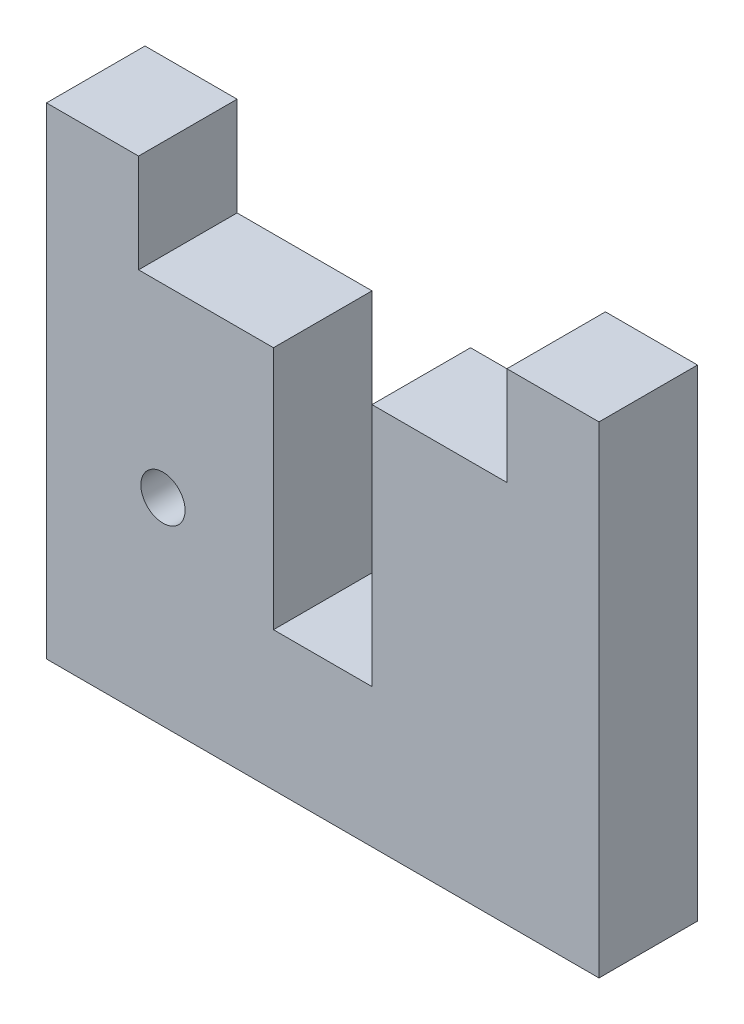
ISO-10303-21;
HEADER;
FILE_DESCRIPTION(('STEP AP214'),'2;1');
FILE_NAME('part.step','',(''),(''),'','','');
FILE_SCHEMA(('AUTOMOTIVE_DESIGN { 1 0 10303 214 1 1 1 1 }'));
ENDSEC;
DATA;
#1=APPLICATION_CONTEXT('core data for automotive mechanical design processes');
#2=APPLICATION_PROTOCOL_DEFINITION('international standard','automotive_design',2000,#1);
#3=PRODUCT_CONTEXT('',#1,'mechanical');
#4=PRODUCT('Part','Part','',(#3));
#5=PRODUCT_RELATED_PRODUCT_CATEGORY('part','',(#4));
#6=PRODUCT_DEFINITION_FORMATION('','',#4);
#7=PRODUCT_DEFINITION_CONTEXT('part definition',#1,'design');
#8=PRODUCT_DEFINITION('design','',#6,#7);
#9=PRODUCT_DEFINITION_SHAPE('','',#8);
#10=(LENGTH_UNIT() NAMED_UNIT(*) SI_UNIT(.MILLI.,.METRE.));
#11=(NAMED_UNIT(*) PLANE_ANGLE_UNIT() SI_UNIT($,.RADIAN.));
#12=(NAMED_UNIT(*) SI_UNIT($,.STERADIAN.) SOLID_ANGLE_UNIT());
#13=UNCERTAINTY_MEASURE_WITH_UNIT(LENGTH_MEASURE(1.E-05),#10,'distance_accuracy_value','');
#14=(GEOMETRIC_REPRESENTATION_CONTEXT(3) GLOBAL_UNCERTAINTY_ASSIGNED_CONTEXT((#13)) GLOBAL_UNIT_ASSIGNED_CONTEXT((#10,
#11,#12)) REPRESENTATION_CONTEXT('',''));
#15=CARTESIAN_POINT('',(0.,0.,0.));
#16=DIRECTION('',(0.,0.,1.));
#17=DIRECTION('',(1.,0.,0.));
#18=AXIS2_PLACEMENT_3D('',#15,#16,#17);
#19=CARTESIAN_POINT('',(0.,0.,5.35));
#20=DIRECTION('',(0.,0.,-1.));
#21=DIRECTION('',(-1.,0.,0.));
#22=AXIS2_PLACEMENT_3D('',#19,#20,#21);
#23=PLANE('',#22);
#24=DIRECTION('',(0.,-1.,0.));
#25=VECTOR('',#24,1.);
#26=CARTESIAN_POINT('',(-15.,0.,5.35));
#27=LINE('',#26,#25);
#28=CARTESIAN_POINT('',(-15.,26.15,5.35));
#29=VERTEX_POINT('',#28);
#30=CARTESIAN_POINT('',(-15.,0.,5.35));
#31=VERTEX_POINT('',#30);
#32=EDGE_CURVE('E176',#29,#31,#27,.T.);
#33=ORIENTED_EDGE('',*,*,#32,.T.);
#34=DIRECTION('',(1.,0.,0.));
#35=VECTOR('',#34,1.);
#36=CARTESIAN_POINT('',(-15.,0.,5.35));
#37=LINE('',#36,#35);
#38=CARTESIAN_POINT('',(15.,0.,5.35));
#39=VERTEX_POINT('',#38);
#40=EDGE_CURVE('E104',#31,#39,#37,.T.);
#41=ORIENTED_EDGE('',*,*,#40,.T.);
#42=DIRECTION('',(0.,1.,0.));
#43=VECTOR('',#42,1.);
#44=CARTESIAN_POINT('',(15.,0.,5.35));
#45=LINE('',#44,#43);
#46=CARTESIAN_POINT('',(15.,26.15,5.35));
#47=VERTEX_POINT('',#46);
#48=EDGE_CURVE('E203',#39,#47,#45,.T.);
#49=ORIENTED_EDGE('',*,*,#48,.T.);
#50=DIRECTION('',(-1.,0.,0.));
#51=VECTOR('',#50,1.);
#52=CARTESIAN_POINT('',(10.,26.15,5.35));
#53=LINE('',#52,#51);
#54=CARTESIAN_POINT('',(10.,26.15,5.35));
#55=VERTEX_POINT('',#54);
#56=EDGE_CURVE('E222',#47,#55,#53,.T.);
#57=ORIENTED_EDGE('',*,*,#56,.T.);
#58=DIRECTION('',(0.,-1.,0.));
#59=VECTOR('',#58,1.);
#60=CARTESIAN_POINT('',(10.,26.15,5.35));
#61=LINE('',#60,#59);
#62=CARTESIAN_POINT('',(10.,20.8,5.35));
#63=VERTEX_POINT('',#62);
#64=EDGE_CURVE('E219',#55,#63,#61,.T.);
#65=ORIENTED_EDGE('',*,*,#64,.T.);
#66=DIRECTION('',(-1.,0.,0.));
#67=VECTOR('',#66,1.);
#68=CARTESIAN_POINT('',(2.675,20.8,5.35));
#69=LINE('',#68,#67);
#70=CARTESIAN_POINT('',(2.675,20.8,5.35));
#71=VERTEX_POINT('',#70);
#72=EDGE_CURVE('E221',#63,#71,#69,.T.);
#73=ORIENTED_EDGE('',*,*,#72,.T.);
#74=DIRECTION('',(0.,-1.,0.));
#75=VECTOR('',#74,1.);
#76=CARTESIAN_POINT('',(2.675,20.8,5.35));
#77=LINE('',#76,#75);
#78=CARTESIAN_POINT('',(2.675,7.53977462398501,5.35));
#79=VERTEX_POINT('',#78);
#80=EDGE_CURVE('E224',#71,#79,#77,.T.);
#81=ORIENTED_EDGE('',*,*,#80,.T.);
#82=DIRECTION('',(-1.,0.,0.));
#83=VECTOR('',#82,1.);
#84=CARTESIAN_POINT('',(-2.675,7.53977462398501,5.35));
#85=LINE('',#84,#83);
#86=CARTESIAN_POINT('',(-2.675,7.53977462398501,5.35));
#87=VERTEX_POINT('',#86);
#88=EDGE_CURVE('E230',#79,#87,#85,.T.);
#89=ORIENTED_EDGE('',*,*,#88,.T.);
#90=DIRECTION('',(0.,1.,0.));
#91=VECTOR('',#90,1.);
#92=CARTESIAN_POINT('',(-2.675,20.8,5.35));
#93=LINE('',#92,#91);
#94=CARTESIAN_POINT('',(-2.675,20.8,5.35));
#95=VERTEX_POINT('',#94);
#96=EDGE_CURVE('E135',#87,#95,#93,.T.);
#97=ORIENTED_EDGE('',*,*,#96,.T.);
#98=DIRECTION('',(-1.,0.,0.));
#99=VECTOR('',#98,1.);
#100=CARTESIAN_POINT('',(-10.,20.8,5.35));
#101=LINE('',#100,#99);
#102=CARTESIAN_POINT('',(-10.,20.8,5.35));
#103=VERTEX_POINT('',#102);
#104=EDGE_CURVE('E129',#95,#103,#101,.T.);
#105=ORIENTED_EDGE('',*,*,#104,.T.);
#106=DIRECTION('',(0.,1.,0.));
#107=VECTOR('',#106,1.);
#108=CARTESIAN_POINT('',(-10.,26.15,5.35));
#109=LINE('',#108,#107);
#110=CARTESIAN_POINT('',(-10.,26.15,5.35));
#111=VERTEX_POINT('',#110);
#112=EDGE_CURVE('E133',#103,#111,#109,.T.);
#113=ORIENTED_EDGE('',*,*,#112,.T.);
#114=DIRECTION('',(-1.,0.,0.));
#115=VECTOR('',#114,1.);
#116=CARTESIAN_POINT('',(-15.,26.15,5.35));
#117=LINE('',#116,#115);
#118=EDGE_CURVE('E49',#111,#29,#117,.T.);
#119=ORIENTED_EDGE('',*,*,#118,.T.);
#120=EDGE_LOOP('',(#33,#41,#49,#57,#65,#73,#81,#89,#97,#105,#113,#119));
#121=FACE_BOUND('',#120,.T.);
#122=CARTESIAN_POINT('',(-8.675,10.75,5.35));
#123=DIRECTION('',(0.,0.,1.));
#124=DIRECTION('',(1.,0.,0.));
#125=AXIS2_PLACEMENT_3D('',#122,#123,#124);
#126=CIRCLE('',#125,1.2);
#127=CARTESIAN_POINT('',(-7.475,10.75,5.35));
#128=VERTEX_POINT('',#127);
#129=EDGE_CURVE('E157',#128,#128,#126,.T.);
#130=ORIENTED_EDGE('',*,*,#129,.F.);
#131=EDGE_LOOP('',(#130));
#132=FACE_BOUND('',#131,.T.);
#133=ADVANCED_FACE('F32',(#121,#132),#23,.F.);
#134=CARTESIAN_POINT('',(0.,0.,0.));
#135=DIRECTION('',(0.,0.,-1.));
#136=DIRECTION('',(-1.,0.,0.));
#137=AXIS2_PLACEMENT_3D('',#134,#135,#136);
#138=PLANE('',#137);
#139=DIRECTION('',(0.,-1.,0.));
#140=VECTOR('',#139,1.);
#141=CARTESIAN_POINT('',(-15.,0.,0.));
#142=LINE('',#141,#140);
#143=CARTESIAN_POINT('',(-15.,26.15,0.));
#144=VERTEX_POINT('',#143);
#145=CARTESIAN_POINT('',(-15.,0.,0.));
#146=VERTEX_POINT('',#145);
#147=EDGE_CURVE('E153',#144,#146,#142,.T.);
#148=ORIENTED_EDGE('',*,*,#147,.F.);
#149=DIRECTION('',(-1.,0.,0.));
#150=VECTOR('',#149,1.);
#151=CARTESIAN_POINT('',(-15.,26.15,0.));
#152=LINE('',#151,#150);
#153=CARTESIAN_POINT('',(-10.,26.15,0.));
#154=VERTEX_POINT('',#153);
#155=EDGE_CURVE('E96',#154,#144,#152,.T.);
#156=ORIENTED_EDGE('',*,*,#155,.F.);
#157=DIRECTION('',(0.,1.,0.));
#158=VECTOR('',#157,1.);
#159=CARTESIAN_POINT('',(-10.,26.15,0.));
#160=LINE('',#159,#158);
#161=CARTESIAN_POINT('',(-10.,20.8,0.));
#162=VERTEX_POINT('',#161);
#163=EDGE_CURVE('E90',#162,#154,#160,.T.);
#164=ORIENTED_EDGE('',*,*,#163,.F.);
#165=DIRECTION('',(-1.,0.,0.));
#166=VECTOR('',#165,1.);
#167=CARTESIAN_POINT('',(-10.,20.8,0.));
#168=LINE('',#167,#166);
#169=CARTESIAN_POINT('',(-2.675,20.8,0.));
#170=VERTEX_POINT('',#169);
#171=EDGE_CURVE('E143',#170,#162,#168,.T.);
#172=ORIENTED_EDGE('',*,*,#171,.F.);
#173=DIRECTION('',(0.,1.,0.));
#174=VECTOR('',#173,1.);
#175=CARTESIAN_POINT('',(-2.675,20.8,0.));
#176=LINE('',#175,#174);
#177=CARTESIAN_POINT('',(-2.675,7.53977462398501,0.));
#178=VERTEX_POINT('',#177);
#179=EDGE_CURVE('E171',#178,#170,#176,.T.);
#180=ORIENTED_EDGE('',*,*,#179,.F.);
#181=DIRECTION('',(-1.,0.,0.));
#182=VECTOR('',#181,1.);
#183=CARTESIAN_POINT('',(-2.675,7.53977462398501,0.));
#184=LINE('',#183,#182);
#185=CARTESIAN_POINT('',(2.675,7.53977462398501,0.));
#186=VERTEX_POINT('',#185);
#187=EDGE_CURVE('E169',#186,#178,#184,.T.);
#188=ORIENTED_EDGE('',*,*,#187,.F.);
#189=DIRECTION('',(0.,-1.,0.));
#190=VECTOR('',#189,1.);
#191=CARTESIAN_POINT('',(2.675,20.8,0.));
#192=LINE('',#191,#190);
#193=CARTESIAN_POINT('',(2.675,20.8,0.));
#194=VERTEX_POINT('',#193);
#195=EDGE_CURVE('E167',#194,#186,#192,.T.);
#196=ORIENTED_EDGE('',*,*,#195,.F.);
#197=DIRECTION('',(-1.,0.,0.));
#198=VECTOR('',#197,1.);
#199=CARTESIAN_POINT('',(2.675,20.8,0.));
#200=LINE('',#199,#198);
#201=CARTESIAN_POINT('',(10.,20.8,0.));
#202=VERTEX_POINT('',#201);
#203=EDGE_CURVE('E165',#202,#194,#200,.T.);
#204=ORIENTED_EDGE('',*,*,#203,.F.);
#205=DIRECTION('',(0.,-1.,0.));
#206=VECTOR('',#205,1.);
#207=CARTESIAN_POINT('',(10.,26.15,0.));
#208=LINE('',#207,#206);
#209=CARTESIAN_POINT('',(10.,26.15,0.));
#210=VERTEX_POINT('',#209);
#211=EDGE_CURVE('E163',#210,#202,#208,.T.);
#212=ORIENTED_EDGE('',*,*,#211,.F.);
#213=DIRECTION('',(-1.,0.,0.));
#214=VECTOR('',#213,1.);
#215=CARTESIAN_POINT('',(10.,26.15,0.));
#216=LINE('',#215,#214);
#217=CARTESIAN_POINT('',(15.,26.15,0.));
#218=VERTEX_POINT('',#217);
#219=EDGE_CURVE('E161',#218,#210,#216,.T.);
#220=ORIENTED_EDGE('',*,*,#219,.F.);
#221=DIRECTION('',(0.,1.,0.));
#222=VECTOR('',#221,1.);
#223=CARTESIAN_POINT('',(15.,0.,0.));
#224=LINE('',#223,#222);
#225=CARTESIAN_POINT('',(15.,0.,0.));
#226=VERTEX_POINT('',#225);
#227=EDGE_CURVE('E159',#226,#218,#224,.T.);
#228=ORIENTED_EDGE('',*,*,#227,.F.);
#229=DIRECTION('',(1.,0.,0.));
#230=VECTOR('',#229,1.);
#231=CARTESIAN_POINT('',(-15.,0.,0.));
#232=LINE('',#231,#230);
#233=EDGE_CURVE('E156',#146,#226,#232,.T.);
#234=ORIENTED_EDGE('',*,*,#233,.F.);
#235=EDGE_LOOP('',(#148,#156,#164,#172,#180,#188,#196,#204,#212,#220,#228,#234));
#236=FACE_BOUND('',#235,.T.);
#237=CARTESIAN_POINT('',(-8.675,10.75,0.));
#238=DIRECTION('',(0.,0.,1.));
#239=DIRECTION('',(1.,0.,0.));
#240=AXIS2_PLACEMENT_3D('',#237,#238,#239);
#241=CIRCLE('',#240,1.2);
#242=CARTESIAN_POINT('',(-7.475,10.75,0.));
#243=VERTEX_POINT('',#242);
#244=EDGE_CURVE('E377',#243,#243,#241,.T.);
#245=ORIENTED_EDGE('',*,*,#244,.T.);
#246=EDGE_LOOP('',(#245));
#247=FACE_BOUND('',#246,.T.);
#248=ADVANCED_FACE('F207',(#236,#247),#138,.T.);
#249=CARTESIAN_POINT('',(-15.,0.,5.35));
#250=DIRECTION('',(1.,0.,0.));
#251=DIRECTION('',(0.,0.,-1.));
#252=AXIS2_PLACEMENT_3D('',#249,#250,#251);
#253=PLANE('',#252);
#254=ORIENTED_EDGE('',*,*,#147,.T.);
#255=DIRECTION('',(0.,0.,-1.));
#256=VECTOR('',#255,1.);
#257=CARTESIAN_POINT('',(-15.,0.,5.35));
#258=LINE('',#257,#256);
#259=EDGE_CURVE('E11',#31,#146,#258,.T.);
#260=ORIENTED_EDGE('',*,*,#259,.F.);
#261=ORIENTED_EDGE('',*,*,#32,.F.);
#262=DIRECTION('',(0.,0.,-1.));
#263=VECTOR('',#262,1.);
#264=CARTESIAN_POINT('',(-15.,26.15,5.35));
#265=LINE('',#264,#263);
#266=EDGE_CURVE('E149',#29,#144,#265,.T.);
#267=ORIENTED_EDGE('',*,*,#266,.T.);
#268=EDGE_LOOP('',(#254,#260,#261,#267));
#269=FACE_BOUND('',#268,.T.);
#270=ADVANCED_FACE('F34',(#269),#253,.F.);
#271=CARTESIAN_POINT('',(-15.,0.,5.35));
#272=DIRECTION('',(0.,1.,0.));
#273=DIRECTION('',(0.,0.,1.));
#274=AXIS2_PLACEMENT_3D('',#271,#272,#273);
#275=PLANE('',#274);
#276=ORIENTED_EDGE('',*,*,#233,.T.);
#277=DIRECTION('',(0.,0.,-1.));
#278=VECTOR('',#277,1.);
#279=CARTESIAN_POINT('',(15.,0.,5.35));
#280=LINE('',#279,#278);
#281=EDGE_CURVE('E41',#39,#226,#280,.T.);
#282=ORIENTED_EDGE('',*,*,#281,.F.);
#283=ORIENTED_EDGE('',*,*,#40,.F.);
#284=ORIENTED_EDGE('',*,*,#259,.T.);
#285=EDGE_LOOP('',(#276,#282,#283,#284));
#286=FACE_BOUND('',#285,.T.);
#287=ADVANCED_FACE('F264',(#286),#275,.F.);
#288=CARTESIAN_POINT('',(15.,0.,5.35));
#289=DIRECTION('',(-1.,0.,0.));
#290=DIRECTION('',(0.,0.,1.));
#291=AXIS2_PLACEMENT_3D('',#288,#289,#290);
#292=PLANE('',#291);
#293=ORIENTED_EDGE('',*,*,#227,.T.);
#294=DIRECTION('',(0.,0.,-1.));
#295=VECTOR('',#294,1.);
#296=CARTESIAN_POINT('',(15.,26.15,5.35));
#297=LINE('',#296,#295);
#298=EDGE_CURVE('E195',#47,#218,#297,.T.);
#299=ORIENTED_EDGE('',*,*,#298,.F.);
#300=ORIENTED_EDGE('',*,*,#48,.F.);
#301=ORIENTED_EDGE('',*,*,#281,.T.);
#302=EDGE_LOOP('',(#293,#299,#300,#301));
#303=FACE_BOUND('',#302,.T.);
#304=ADVANCED_FACE('F201',(#303),#292,.F.);
#305=CARTESIAN_POINT('',(10.,26.15,5.35));
#306=DIRECTION('',(0.,-1.,0.));
#307=DIRECTION('',(0.,0.,-1.));
#308=AXIS2_PLACEMENT_3D('',#305,#306,#307);
#309=PLANE('',#308);
#310=ORIENTED_EDGE('',*,*,#219,.T.);
#311=DIRECTION('',(0.,0.,-1.));
#312=VECTOR('',#311,1.);
#313=CARTESIAN_POINT('',(10.,26.15,5.35));
#314=LINE('',#313,#312);
#315=EDGE_CURVE('E192',#55,#210,#314,.T.);
#316=ORIENTED_EDGE('',*,*,#315,.F.);
#317=ORIENTED_EDGE('',*,*,#56,.F.);
#318=ORIENTED_EDGE('',*,*,#298,.T.);
#319=EDGE_LOOP('',(#310,#316,#317,#318));
#320=FACE_BOUND('',#319,.T.);
#321=ADVANCED_FACE('F213',(#320),#309,.F.);
#322=CARTESIAN_POINT('',(10.,26.15,5.35));
#323=DIRECTION('',(1.,0.,0.));
#324=DIRECTION('',(0.,1.,0.));
#325=AXIS2_PLACEMENT_3D('',#322,#323,#324);
#326=PLANE('',#325);
#327=ORIENTED_EDGE('',*,*,#211,.T.);
#328=DIRECTION('',(0.,0.,-1.));
#329=VECTOR('',#328,1.);
#330=CARTESIAN_POINT('',(10.,20.8,5.35));
#331=LINE('',#330,#329);
#332=EDGE_CURVE('E189',#63,#202,#331,.T.);
#333=ORIENTED_EDGE('',*,*,#332,.F.);
#334=ORIENTED_EDGE('',*,*,#64,.F.);
#335=ORIENTED_EDGE('',*,*,#315,.T.);
#336=EDGE_LOOP('',(#327,#333,#334,#335));
#337=FACE_BOUND('',#336,.T.);
#338=ADVANCED_FACE('F217',(#337),#326,.F.);
#339=CARTESIAN_POINT('',(2.675,20.8,5.35));
#340=DIRECTION('',(0.,-1.,0.));
#341=DIRECTION('',(0.,0.,-1.));
#342=AXIS2_PLACEMENT_3D('',#339,#340,#341);
#343=PLANE('',#342);
#344=ORIENTED_EDGE('',*,*,#203,.T.);
#345=DIRECTION('',(0.,0.,-1.));
#346=VECTOR('',#345,1.);
#347=CARTESIAN_POINT('',(2.675,20.8,5.35));
#348=LINE('',#347,#346);
#349=EDGE_CURVE('E186',#71,#194,#348,.T.);
#350=ORIENTED_EDGE('',*,*,#349,.F.);
#351=ORIENTED_EDGE('',*,*,#72,.F.);
#352=ORIENTED_EDGE('',*,*,#332,.T.);
#353=EDGE_LOOP('',(#344,#350,#351,#352));
#354=FACE_BOUND('',#353,.T.);
#355=ADVANCED_FACE('F277',(#354),#343,.F.);
#356=CARTESIAN_POINT('',(2.675,20.8,5.35));
#357=DIRECTION('',(1.,0.,0.));
#358=DIRECTION('',(0.,1.,0.));
#359=AXIS2_PLACEMENT_3D('',#356,#357,#358);
#360=PLANE('',#359);
#361=ORIENTED_EDGE('',*,*,#195,.T.);
#362=DIRECTION('',(0.,0.,-1.));
#363=VECTOR('',#362,1.);
#364=CARTESIAN_POINT('',(2.675,7.53977462398501,5.35));
#365=LINE('',#364,#363);
#366=EDGE_CURVE('E183',#79,#186,#365,.T.);
#367=ORIENTED_EDGE('',*,*,#366,.F.);
#368=ORIENTED_EDGE('',*,*,#80,.F.);
#369=ORIENTED_EDGE('',*,*,#349,.T.);
#370=EDGE_LOOP('',(#361,#367,#368,#369));
#371=FACE_BOUND('',#370,.T.);
#372=ADVANCED_FACE('F280',(#371),#360,.F.);
#373=CARTESIAN_POINT('',(-2.675,7.53977462398501,5.35));
#374=DIRECTION('',(0.,-1.,0.));
#375=DIRECTION('',(0.,0.,-1.));
#376=AXIS2_PLACEMENT_3D('',#373,#374,#375);
#377=PLANE('',#376);
#378=ORIENTED_EDGE('',*,*,#187,.T.);
#379=DIRECTION('',(0.,0.,-1.));
#380=VECTOR('',#379,1.);
#381=CARTESIAN_POINT('',(-2.675,7.53977462398501,5.35));
#382=LINE('',#381,#380);
#383=EDGE_CURVE('E180',#87,#178,#382,.T.);
#384=ORIENTED_EDGE('',*,*,#383,.F.);
#385=ORIENTED_EDGE('',*,*,#88,.F.);
#386=ORIENTED_EDGE('',*,*,#366,.T.);
#387=EDGE_LOOP('',(#378,#384,#385,#386));
#388=FACE_BOUND('',#387,.T.);
#389=ADVANCED_FACE('F236',(#388),#377,.F.);
#390=CARTESIAN_POINT('',(-2.675,20.8,5.35));
#391=DIRECTION('',(-1.,0.,0.));
#392=DIRECTION('',(0.,-1.,0.));
#393=AXIS2_PLACEMENT_3D('',#390,#391,#392);
#394=PLANE('',#393);
#395=ORIENTED_EDGE('',*,*,#179,.T.);
#396=DIRECTION('',(0.,0.,-1.));
#397=VECTOR('',#396,1.);
#398=CARTESIAN_POINT('',(-2.675,20.8,5.35));
#399=LINE('',#398,#397);
#400=EDGE_CURVE('E144',#95,#170,#399,.T.);
#401=ORIENTED_EDGE('',*,*,#400,.F.);
#402=ORIENTED_EDGE('',*,*,#96,.F.);
#403=ORIENTED_EDGE('',*,*,#383,.T.);
#404=EDGE_LOOP('',(#395,#401,#402,#403));
#405=FACE_BOUND('',#404,.T.);
#406=ADVANCED_FACE('F240',(#405),#394,.F.);
#407=CARTESIAN_POINT('',(-10.,20.8,5.35));
#408=DIRECTION('',(0.,-1.,0.));
#409=DIRECTION('',(0.,0.,-1.));
#410=AXIS2_PLACEMENT_3D('',#407,#408,#409);
#411=PLANE('',#410);
#412=ORIENTED_EDGE('',*,*,#171,.T.);
#413=DIRECTION('',(0.,0.,-1.));
#414=VECTOR('',#413,1.);
#415=CARTESIAN_POINT('',(-10.,20.8,5.35));
#416=LINE('',#415,#414);
#417=EDGE_CURVE('E140',#103,#162,#416,.T.);
#418=ORIENTED_EDGE('',*,*,#417,.F.);
#419=ORIENTED_EDGE('',*,*,#104,.F.);
#420=ORIENTED_EDGE('',*,*,#400,.T.);
#421=EDGE_LOOP('',(#412,#418,#419,#420));
#422=FACE_BOUND('',#421,.T.);
#423=ADVANCED_FACE('F141',(#422),#411,.F.);
#424=CARTESIAN_POINT('',(-10.,26.15,5.35));
#425=DIRECTION('',(-1.,0.,0.));
#426=DIRECTION('',(0.,-1.,0.));
#427=AXIS2_PLACEMENT_3D('',#424,#425,#426);
#428=PLANE('',#427);
#429=ORIENTED_EDGE('',*,*,#163,.T.);
#430=DIRECTION('',(0.,0.,-1.));
#431=VECTOR('',#430,1.);
#432=CARTESIAN_POINT('',(-10.,26.15,5.35));
#433=LINE('',#432,#431);
#434=EDGE_CURVE('E145',#111,#154,#433,.T.);
#435=ORIENTED_EDGE('',*,*,#434,.F.);
#436=ORIENTED_EDGE('',*,*,#112,.F.);
#437=ORIENTED_EDGE('',*,*,#417,.T.);
#438=EDGE_LOOP('',(#429,#435,#436,#437));
#439=FACE_BOUND('',#438,.T.);
#440=ADVANCED_FACE('F147',(#439),#428,.F.);
#441=CARTESIAN_POINT('',(-15.,26.15,5.35));
#442=DIRECTION('',(0.,-1.,0.));
#443=DIRECTION('',(0.,0.,-1.));
#444=AXIS2_PLACEMENT_3D('',#441,#442,#443);
#445=PLANE('',#444);
#446=ORIENTED_EDGE('',*,*,#155,.T.);
#447=ORIENTED_EDGE('',*,*,#266,.F.);
#448=ORIENTED_EDGE('',*,*,#118,.F.);
#449=ORIENTED_EDGE('',*,*,#434,.T.);
#450=EDGE_LOOP('',(#446,#447,#448,#449));
#451=FACE_BOUND('',#450,.T.);
#452=ADVANCED_FACE('F244',(#451),#445,.F.);
#453=CARTESIAN_POINT('',(-8.675,10.75,5.35));
#454=DIRECTION('',(0.,0.,-1.));
#455=DIRECTION('',(-1.,0.,0.));
#456=AXIS2_PLACEMENT_3D('',#453,#454,#455);
#457=CYLINDRICAL_SURFACE('',#456,1.2);
#458=ORIENTED_EDGE('',*,*,#129,.T.);
#459=EDGE_LOOP('',(#458));
#460=FACE_BOUND('',#459,.T.);
#461=ORIENTED_EDGE('',*,*,#244,.F.);
#462=EDGE_LOOP('',(#461));
#463=FACE_BOUND('',#462,.T.);
#464=ADVANCED_FACE('F246',(#460,#463),#457,.F.);
#465=CLOSED_SHELL('',(#133,#248,#270,#287,#304,#321,#338,#355,#372,#389,#406,#423,#440,#452,#464));
#466=MANIFOLD_SOLID_BREP('B2',#465);
#467=ADVANCED_BREP_SHAPE_REPRESENTATION('',(#18,#466),#14);
#468=SHAPE_DEFINITION_REPRESENTATION(#9,#467);
ENDSEC;
END-ISO-10303-21;
